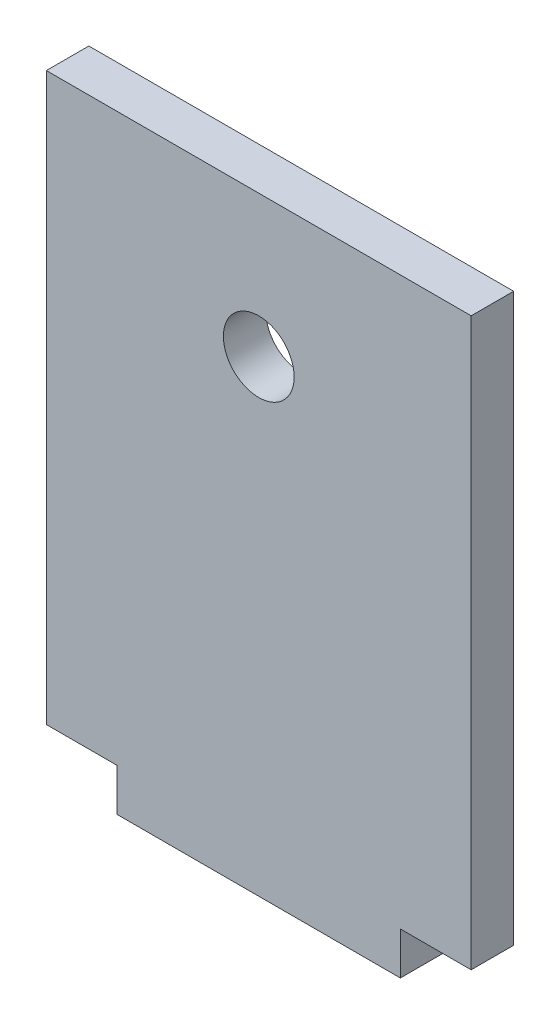
ISO-10303-21;
HEADER;
FILE_DESCRIPTION(('STEP AP214'),'2;1');
FILE_NAME('part.step','',(''),(''),'','','');
FILE_SCHEMA(('AUTOMOTIVE_DESIGN { 1 0 10303 214 1 1 1 1 }'));
ENDSEC;
DATA;
#1=APPLICATION_CONTEXT('core data for automotive mechanical design processes');
#2=APPLICATION_PROTOCOL_DEFINITION('international standard','automotive_design',2000,#1);
#3=PRODUCT_CONTEXT('',#1,'mechanical');
#4=PRODUCT('Part','Part','',(#3));
#5=PRODUCT_RELATED_PRODUCT_CATEGORY('part','',(#4));
#6=PRODUCT_DEFINITION_FORMATION('','',#4);
#7=PRODUCT_DEFINITION_CONTEXT('part definition',#1,'design');
#8=PRODUCT_DEFINITION('design','',#6,#7);
#9=PRODUCT_DEFINITION_SHAPE('','',#8);
#10=(LENGTH_UNIT() NAMED_UNIT(*) SI_UNIT(.MILLI.,.METRE.));
#11=(NAMED_UNIT(*) PLANE_ANGLE_UNIT() SI_UNIT($,.RADIAN.));
#12=(NAMED_UNIT(*) SI_UNIT($,.STERADIAN.) SOLID_ANGLE_UNIT());
#13=UNCERTAINTY_MEASURE_WITH_UNIT(LENGTH_MEASURE(1.E-05),#10,'distance_accuracy_value','');
#14=(GEOMETRIC_REPRESENTATION_CONTEXT(3) GLOBAL_UNCERTAINTY_ASSIGNED_CONTEXT((#13)) GLOBAL_UNIT_ASSIGNED_CONTEXT((#10,
#11,#12)) REPRESENTATION_CONTEXT('',''));
#15=CARTESIAN_POINT('',(0.,0.,0.));
#16=DIRECTION('',(0.,0.,1.));
#17=DIRECTION('',(1.,0.,0.));
#18=AXIS2_PLACEMENT_3D('',#15,#16,#17);
#19=CARTESIAN_POINT('',(0.,0.,3.));
#20=DIRECTION('',(0.,0.,1.));
#21=DIRECTION('',(1.,0.,0.));
#22=AXIS2_PLACEMENT_3D('',#19,#20,#21);
#23=PLANE('',#22);
#24=DIRECTION('',(0.,-1.,0.));
#25=VECTOR('',#24,1.);
#26=CARTESIAN_POINT('',(-15.,-20.,3.));
#27=LINE('',#26,#25);
#28=CARTESIAN_POINT('',(-15.,20.,3.));
#29=VERTEX_POINT('',#28);
#30=CARTESIAN_POINT('',(-15.,-20.,3.));
#31=VERTEX_POINT('',#30);
#32=EDGE_CURVE('E164',#29,#31,#27,.T.);
#33=ORIENTED_EDGE('',*,*,#32,.T.);
#34=DIRECTION('',(1.,0.,0.));
#35=VECTOR('',#34,1.);
#36=CARTESIAN_POINT('',(-10.,-20.,3.));
#37=LINE('',#36,#35);
#38=CARTESIAN_POINT('',(-10.,-20.,3.));
#39=VERTEX_POINT('',#38);
#40=EDGE_CURVE('E100',#31,#39,#37,.T.);
#41=ORIENTED_EDGE('',*,*,#40,.T.);
#42=DIRECTION('',(0.,-1.,0.));
#43=VECTOR('',#42,1.);
#44=CARTESIAN_POINT('',(-10.,-20.,3.));
#45=LINE('',#44,#43);
#46=CARTESIAN_POINT('',(-10.,-23.,3.));
#47=VERTEX_POINT('',#46);
#48=EDGE_CURVE('E185',#39,#47,#45,.T.);
#49=ORIENTED_EDGE('',*,*,#48,.T.);
#50=DIRECTION('',(1.,0.,0.));
#51=VECTOR('',#50,1.);
#52=CARTESIAN_POINT('',(-10.,-23.,3.));
#53=LINE('',#52,#51);
#54=CARTESIAN_POINT('',(9.99999999999999,-23.,3.));
#55=VERTEX_POINT('',#54);
#56=EDGE_CURVE('E199',#47,#55,#53,.T.);
#57=ORIENTED_EDGE('',*,*,#56,.T.);
#58=DIRECTION('',(0.,1.,0.));
#59=VECTOR('',#58,1.);
#60=CARTESIAN_POINT('',(9.99999999999999,-23.,3.));
#61=LINE('',#60,#59);
#62=CARTESIAN_POINT('',(9.99999999999999,-20.,3.));
#63=VERTEX_POINT('',#62);
#64=EDGE_CURVE('E119',#55,#63,#61,.T.);
#65=ORIENTED_EDGE('',*,*,#64,.T.);
#66=DIRECTION('',(1.,0.,0.));
#67=VECTOR('',#66,1.);
#68=CARTESIAN_POINT('',(15.,-20.,3.));
#69=LINE('',#68,#67);
#70=CARTESIAN_POINT('',(15.,-20.,3.));
#71=VERTEX_POINT('',#70);
#72=EDGE_CURVE('E113',#63,#71,#69,.T.);
#73=ORIENTED_EDGE('',*,*,#72,.T.);
#74=DIRECTION('',(0.,1.,0.));
#75=VECTOR('',#74,1.);
#76=CARTESIAN_POINT('',(15.,-20.,3.));
#77=LINE('',#76,#75);
#78=CARTESIAN_POINT('',(15.,20.,3.));
#79=VERTEX_POINT('',#78);
#80=EDGE_CURVE('E117',#71,#79,#77,.T.);
#81=ORIENTED_EDGE('',*,*,#80,.T.);
#82=DIRECTION('',(-1.,0.,0.));
#83=VECTOR('',#82,1.);
#84=CARTESIAN_POINT('',(15.,20.,3.));
#85=LINE('',#84,#83);
#86=EDGE_CURVE('E57',#79,#29,#85,.T.);
#87=ORIENTED_EDGE('',*,*,#86,.T.);
#88=EDGE_LOOP('',(#33,#41,#49,#57,#65,#73,#81,#87));
#89=FACE_BOUND('',#88,.T.);
#90=CARTESIAN_POINT('',(0.,10.,3.));
#91=DIRECTION('',(0.,0.,1.));
#92=DIRECTION('',(1.,0.,0.));
#93=AXIS2_PLACEMENT_3D('',#90,#91,#92);
#94=CIRCLE('',#93,2.5);
#95=CARTESIAN_POINT('',(2.5,10.,3.));
#96=VERTEX_POINT('',#95);
#97=EDGE_CURVE('E146',#96,#96,#94,.T.);
#98=ORIENTED_EDGE('',*,*,#97,.F.);
#99=EDGE_LOOP('',(#98));
#100=FACE_BOUND('',#99,.T.);
#101=ADVANCED_FACE('F39',(#89,#100),#23,.T.);
#102=CARTESIAN_POINT('',(0.,0.,0.));
#103=DIRECTION('',(0.,0.,1.));
#104=DIRECTION('',(1.,0.,0.));
#105=AXIS2_PLACEMENT_3D('',#102,#103,#104);
#106=PLANE('',#105);
#107=DIRECTION('',(0.,-1.,0.));
#108=VECTOR('',#107,1.);
#109=CARTESIAN_POINT('',(-15.,-20.,0.));
#110=LINE('',#109,#108);
#111=CARTESIAN_POINT('',(-15.,20.,0.));
#112=VERTEX_POINT('',#111);
#113=CARTESIAN_POINT('',(-15.,-20.,0.));
#114=VERTEX_POINT('',#113);
#115=EDGE_CURVE('E141',#112,#114,#110,.T.);
#116=ORIENTED_EDGE('',*,*,#115,.F.);
#117=DIRECTION('',(-1.,0.,0.));
#118=VECTOR('',#117,1.);
#119=CARTESIAN_POINT('',(15.,20.,0.));
#120=LINE('',#119,#118);
#121=CARTESIAN_POINT('',(15.,20.,0.));
#122=VERTEX_POINT('',#121);
#123=EDGE_CURVE('E92',#122,#112,#120,.T.);
#124=ORIENTED_EDGE('',*,*,#123,.F.);
#125=DIRECTION('',(0.,1.,0.));
#126=VECTOR('',#125,1.);
#127=CARTESIAN_POINT('',(15.,-20.,0.));
#128=LINE('',#127,#126);
#129=CARTESIAN_POINT('',(15.,-20.,0.));
#130=VERTEX_POINT('',#129);
#131=EDGE_CURVE('E86',#130,#122,#128,.T.);
#132=ORIENTED_EDGE('',*,*,#131,.F.);
#133=DIRECTION('',(1.,0.,0.));
#134=VECTOR('',#133,1.);
#135=CARTESIAN_POINT('',(15.,-20.,0.));
#136=LINE('',#135,#134);
#137=CARTESIAN_POINT('',(9.99999999999999,-20.,0.));
#138=VERTEX_POINT('',#137);
#139=EDGE_CURVE('E128',#138,#130,#136,.T.);
#140=ORIENTED_EDGE('',*,*,#139,.F.);
#141=DIRECTION('',(0.,1.,0.));
#142=VECTOR('',#141,1.);
#143=CARTESIAN_POINT('',(9.99999999999999,-23.,0.));
#144=LINE('',#143,#142);
#145=CARTESIAN_POINT('',(9.99999999999999,-23.,0.));
#146=VERTEX_POINT('',#145);
#147=EDGE_CURVE('E155',#146,#138,#144,.T.);
#148=ORIENTED_EDGE('',*,*,#147,.F.);
#149=DIRECTION('',(1.,0.,0.));
#150=VECTOR('',#149,1.);
#151=CARTESIAN_POINT('',(-10.,-23.,0.));
#152=LINE('',#151,#150);
#153=CARTESIAN_POINT('',(-10.,-23.,0.));
#154=VERTEX_POINT('',#153);
#155=EDGE_CURVE('E152',#154,#146,#152,.T.);
#156=ORIENTED_EDGE('',*,*,#155,.F.);
#157=DIRECTION('',(0.,-1.,0.));
#158=VECTOR('',#157,1.);
#159=CARTESIAN_POINT('',(-10.,-20.,0.));
#160=LINE('',#159,#158);
#161=CARTESIAN_POINT('',(-10.,-20.,0.));
#162=VERTEX_POINT('',#161);
#163=EDGE_CURVE('E149',#162,#154,#160,.T.);
#164=ORIENTED_EDGE('',*,*,#163,.F.);
#165=DIRECTION('',(1.,0.,0.));
#166=VECTOR('',#165,1.);
#167=CARTESIAN_POINT('',(-10.,-20.,0.));
#168=LINE('',#167,#166);
#169=EDGE_CURVE('E145',#114,#162,#168,.T.);
#170=ORIENTED_EDGE('',*,*,#169,.F.);
#171=EDGE_LOOP('',(#116,#124,#132,#140,#148,#156,#164,#170));
#172=FACE_BOUND('',#171,.T.);
#173=CARTESIAN_POINT('',(0.,10.,0.));
#174=DIRECTION('',(0.,0.,1.));
#175=DIRECTION('',(1.,0.,0.));
#176=AXIS2_PLACEMENT_3D('',#173,#174,#175);
#177=CIRCLE('',#176,2.5);
#178=CARTESIAN_POINT('',(2.5,10.,0.));
#179=VERTEX_POINT('',#178);
#180=EDGE_CURVE('E209',#179,#179,#177,.T.);
#181=ORIENTED_EDGE('',*,*,#180,.T.);
#182=EDGE_LOOP('',(#181));
#183=FACE_BOUND('',#182,.T.);
#184=ADVANCED_FACE('F189',(#172,#183),#106,.F.);
#185=CARTESIAN_POINT('',(-15.,-20.,3.));
#186=DIRECTION('',(1.,0.,0.));
#187=DIRECTION('',(0.,0.,-1.));
#188=AXIS2_PLACEMENT_3D('',#185,#186,#187);
#189=PLANE('',#188);
#190=ORIENTED_EDGE('',*,*,#115,.T.);
#191=DIRECTION('',(0.,0.,-1.));
#192=VECTOR('',#191,1.);
#193=CARTESIAN_POINT('',(-15.,-20.,3.));
#194=LINE('',#193,#192);
#195=EDGE_CURVE('E11',#31,#114,#194,.T.);
#196=ORIENTED_EDGE('',*,*,#195,.F.);
#197=ORIENTED_EDGE('',*,*,#32,.F.);
#198=DIRECTION('',(0.,0.,-1.));
#199=VECTOR('',#198,1.);
#200=CARTESIAN_POINT('',(-15.,20.,3.));
#201=LINE('',#200,#199);
#202=EDGE_CURVE('E137',#29,#112,#201,.T.);
#203=ORIENTED_EDGE('',*,*,#202,.T.);
#204=EDGE_LOOP('',(#190,#196,#197,#203));
#205=FACE_BOUND('',#204,.T.);
#206=ADVANCED_FACE('F41',(#205),#189,.F.);
#207=CARTESIAN_POINT('',(-10.,-20.,3.));
#208=DIRECTION('',(0.,1.,0.));
#209=DIRECTION('',(0.,0.,1.));
#210=AXIS2_PLACEMENT_3D('',#207,#208,#209);
#211=PLANE('',#210);
#212=ORIENTED_EDGE('',*,*,#169,.T.);
#213=DIRECTION('',(0.,0.,-1.));
#214=VECTOR('',#213,1.);
#215=CARTESIAN_POINT('',(-10.,-20.,3.));
#216=LINE('',#215,#214);
#217=EDGE_CURVE('E49',#39,#162,#216,.T.);
#218=ORIENTED_EDGE('',*,*,#217,.F.);
#219=ORIENTED_EDGE('',*,*,#40,.F.);
#220=ORIENTED_EDGE('',*,*,#195,.T.);
#221=EDGE_LOOP('',(#212,#218,#219,#220));
#222=FACE_BOUND('',#221,.T.);
#223=ADVANCED_FACE('F239',(#222),#211,.F.);
#224=CARTESIAN_POINT('',(-10.,-20.,3.));
#225=DIRECTION('',(1.,0.,0.));
#226=DIRECTION('',(0.,1.,0.));
#227=AXIS2_PLACEMENT_3D('',#224,#225,#226);
#228=PLANE('',#227);
#229=ORIENTED_EDGE('',*,*,#163,.T.);
#230=DIRECTION('',(0.,0.,-1.));
#231=VECTOR('',#230,1.);
#232=CARTESIAN_POINT('',(-10.,-23.,3.));
#233=LINE('',#232,#231);
#234=EDGE_CURVE('E175',#47,#154,#233,.T.);
#235=ORIENTED_EDGE('',*,*,#234,.F.);
#236=ORIENTED_EDGE('',*,*,#48,.F.);
#237=ORIENTED_EDGE('',*,*,#217,.T.);
#238=EDGE_LOOP('',(#229,#235,#236,#237));
#239=FACE_BOUND('',#238,.T.);
#240=ADVANCED_FACE('F183',(#239),#228,.F.);
#241=CARTESIAN_POINT('',(-10.,-23.,3.));
#242=DIRECTION('',(0.,1.,0.));
#243=DIRECTION('',(0.,0.,1.));
#244=AXIS2_PLACEMENT_3D('',#241,#242,#243);
#245=PLANE('',#244);
#246=ORIENTED_EDGE('',*,*,#155,.T.);
#247=DIRECTION('',(0.,0.,-1.));
#248=VECTOR('',#247,1.);
#249=CARTESIAN_POINT('',(9.99999999999999,-23.,3.));
#250=LINE('',#249,#248);
#251=EDGE_CURVE('E171',#55,#146,#250,.T.);
#252=ORIENTED_EDGE('',*,*,#251,.F.);
#253=ORIENTED_EDGE('',*,*,#56,.F.);
#254=ORIENTED_EDGE('',*,*,#234,.T.);
#255=EDGE_LOOP('',(#246,#252,#253,#254));
#256=FACE_BOUND('',#255,.T.);
#257=ADVANCED_FACE('F194',(#256),#245,.F.);
#258=CARTESIAN_POINT('',(9.99999999999999,-23.,3.));
#259=DIRECTION('',(-1.,0.,0.));
#260=DIRECTION('',(0.,-1.,0.));
#261=AXIS2_PLACEMENT_3D('',#258,#259,#260);
#262=PLANE('',#261);
#263=ORIENTED_EDGE('',*,*,#147,.T.);
#264=DIRECTION('',(0.,0.,-1.));
#265=VECTOR('',#264,1.);
#266=CARTESIAN_POINT('',(9.99999999999999,-20.,3.));
#267=LINE('',#266,#265);
#268=EDGE_CURVE('E130',#63,#138,#267,.T.);
#269=ORIENTED_EDGE('',*,*,#268,.F.);
#270=ORIENTED_EDGE('',*,*,#64,.F.);
#271=ORIENTED_EDGE('',*,*,#251,.T.);
#272=EDGE_LOOP('',(#263,#269,#270,#271));
#273=FACE_BOUND('',#272,.T.);
#274=ADVANCED_FACE('F197',(#273),#262,.F.);
#275=CARTESIAN_POINT('',(15.,-20.,3.));
#276=DIRECTION('',(0.,1.,0.));
#277=DIRECTION('',(0.,0.,1.));
#278=AXIS2_PLACEMENT_3D('',#275,#276,#277);
#279=PLANE('',#278);
#280=ORIENTED_EDGE('',*,*,#139,.T.);
#281=DIRECTION('',(0.,0.,-1.));
#282=VECTOR('',#281,1.);
#283=CARTESIAN_POINT('',(15.,-20.,3.));
#284=LINE('',#283,#282);
#285=EDGE_CURVE('E125',#71,#130,#284,.T.);
#286=ORIENTED_EDGE('',*,*,#285,.F.);
#287=ORIENTED_EDGE('',*,*,#72,.F.);
#288=ORIENTED_EDGE('',*,*,#268,.T.);
#289=EDGE_LOOP('',(#280,#286,#287,#288));
#290=FACE_BOUND('',#289,.T.);
#291=ADVANCED_FACE('F126',(#290),#279,.F.);
#292=CARTESIAN_POINT('',(15.,-20.,3.));
#293=DIRECTION('',(-1.,0.,0.));
#294=DIRECTION('',(0.,0.,1.));
#295=AXIS2_PLACEMENT_3D('',#292,#293,#294);
#296=PLANE('',#295);
#297=ORIENTED_EDGE('',*,*,#131,.T.);
#298=DIRECTION('',(0.,0.,-1.));
#299=VECTOR('',#298,1.);
#300=CARTESIAN_POINT('',(15.,20.,3.));
#301=LINE('',#300,#299);
#302=EDGE_CURVE('E131',#79,#122,#301,.T.);
#303=ORIENTED_EDGE('',*,*,#302,.F.);
#304=ORIENTED_EDGE('',*,*,#80,.F.);
#305=ORIENTED_EDGE('',*,*,#285,.T.);
#306=EDGE_LOOP('',(#297,#303,#304,#305));
#307=FACE_BOUND('',#306,.T.);
#308=ADVANCED_FACE('F133',(#307),#296,.F.);
#309=CARTESIAN_POINT('',(15.,20.,3.));
#310=DIRECTION('',(0.,-1.,0.));
#311=DIRECTION('',(1.,0.,0.));
#312=AXIS2_PLACEMENT_3D('',#309,#310,#311);
#313=PLANE('',#312);
#314=ORIENTED_EDGE('',*,*,#123,.T.);
#315=ORIENTED_EDGE('',*,*,#202,.F.);
#316=ORIENTED_EDGE('',*,*,#86,.F.);
#317=ORIENTED_EDGE('',*,*,#302,.T.);
#318=EDGE_LOOP('',(#314,#315,#316,#317));
#319=FACE_BOUND('',#318,.T.);
#320=ADVANCED_FACE('F227',(#319),#313,.F.);
#321=CARTESIAN_POINT('',(0.,10.,3.));
#322=DIRECTION('',(0.,0.,-1.));
#323=DIRECTION('',(-1.,0.,0.));
#324=AXIS2_PLACEMENT_3D('',#321,#322,#323);
#325=CYLINDRICAL_SURFACE('',#324,2.5);
#326=ORIENTED_EDGE('',*,*,#97,.T.);
#327=EDGE_LOOP('',(#326));
#328=FACE_BOUND('',#327,.T.);
#329=ORIENTED_EDGE('',*,*,#180,.F.);
#330=EDGE_LOOP('',(#329));
#331=FACE_BOUND('',#330,.T.);
#332=ADVANCED_FACE('F217',(#328,#331),#325,.F.);
#333=CLOSED_SHELL('',(#101,#184,#206,#223,#240,#257,#274,#291,#308,#320,#332));
#334=MANIFOLD_SOLID_BREP('B2',#333);
#335=ADVANCED_BREP_SHAPE_REPRESENTATION('',(#18,#334),#14);
#336=SHAPE_DEFINITION_REPRESENTATION(#9,#335);
ENDSEC;
END-ISO-10303-21;
